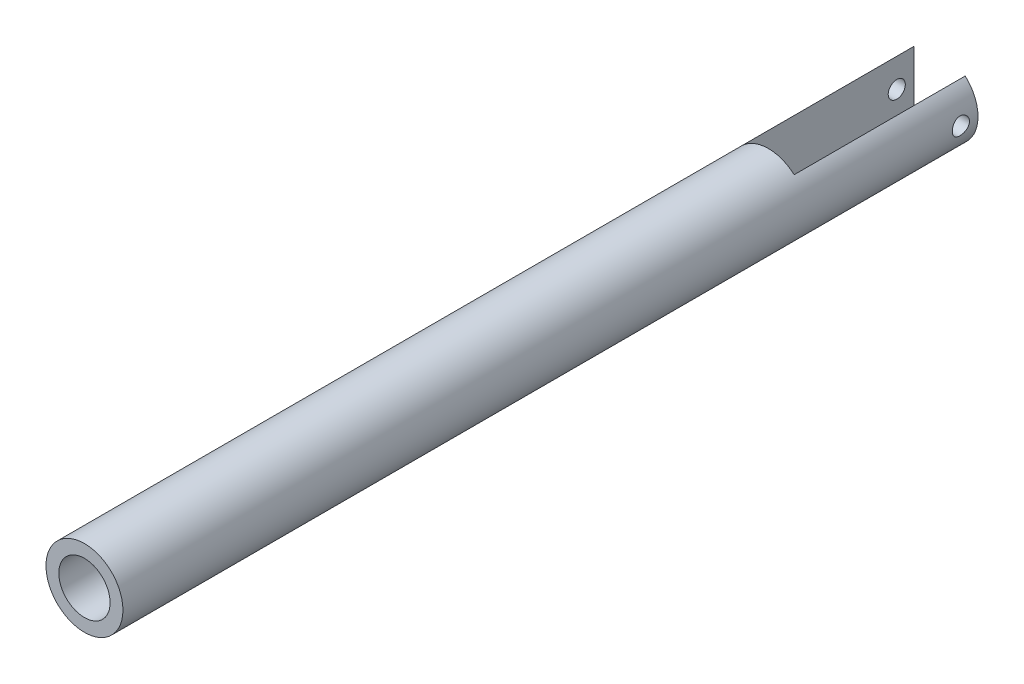
ISO-10303-21;
HEADER;
FILE_DESCRIPTION(('STEP AP214'),'2;1');
FILE_NAME('part.step','',(''),(''),'','','');
FILE_SCHEMA(('AUTOMOTIVE_DESIGN { 1 0 10303 214 1 1 1 1 }'));
ENDSEC;
DATA;
#1=APPLICATION_CONTEXT('core data for automotive mechanical design processes');
#2=APPLICATION_PROTOCOL_DEFINITION('international standard','automotive_design',2000,#1);
#3=PRODUCT_CONTEXT('',#1,'mechanical');
#4=PRODUCT('Part','Part','',(#3));
#5=PRODUCT_RELATED_PRODUCT_CATEGORY('part','',(#4));
#6=PRODUCT_DEFINITION_FORMATION('','',#4);
#7=PRODUCT_DEFINITION_CONTEXT('part definition',#1,'design');
#8=PRODUCT_DEFINITION('design','',#6,#7);
#9=PRODUCT_DEFINITION_SHAPE('','',#8);
#10=(LENGTH_UNIT() NAMED_UNIT(*) SI_UNIT(.MILLI.,.METRE.));
#11=(NAMED_UNIT(*) PLANE_ANGLE_UNIT() SI_UNIT($,.RADIAN.));
#12=(NAMED_UNIT(*) SI_UNIT($,.STERADIAN.) SOLID_ANGLE_UNIT());
#13=UNCERTAINTY_MEASURE_WITH_UNIT(LENGTH_MEASURE(1.E-05),#10,'distance_accuracy_value','');
#14=(GEOMETRIC_REPRESENTATION_CONTEXT(3) GLOBAL_UNCERTAINTY_ASSIGNED_CONTEXT((#13)) GLOBAL_UNIT_ASSIGNED_CONTEXT((#10,
#11,#12)) REPRESENTATION_CONTEXT('',''));
#15=CARTESIAN_POINT('',(0.,0.,0.));
#16=DIRECTION('',(0.,0.,1.));
#17=DIRECTION('',(1.,0.,0.));
#18=AXIS2_PLACEMENT_3D('',#15,#16,#17);
#19=CARTESIAN_POINT('',(0.,0.,80.));
#20=DIRECTION('',(0.,0.,-1.));
#21=DIRECTION('',(-1.,0.,0.));
#22=AXIS2_PLACEMENT_3D('',#19,#20,#21);
#23=CYLINDRICAL_SURFACE('',#22,3.);
#24=CARTESIAN_POINT('',(0.,0.,80.));
#25=DIRECTION('',(0.,0.,1.));
#26=DIRECTION('',(1.,0.,0.));
#27=AXIS2_PLACEMENT_3D('',#24,#25,#26);
#28=CIRCLE('',#27,3.);
#29=CARTESIAN_POINT('',(3.,0.,80.));
#30=VERTEX_POINT('',#29);
#31=EDGE_CURVE('E113',#30,#30,#28,.T.);
#32=ORIENTED_EDGE('',*,*,#31,.T.);
#33=EDGE_LOOP('',(#32));
#34=FACE_BOUND('',#33,.T.);
#35=CARTESIAN_POINT('',(0.,0.,62.));
#36=DIRECTION('',(0.,0.,-1.));
#37=DIRECTION('',(-1.,0.,0.));
#38=AXIS2_PLACEMENT_3D('',#35,#36,#37);
#39=CIRCLE('',#38,3.);
#40=CARTESIAN_POINT('',(-3.,0.,62.));
#41=VERTEX_POINT('',#40);
#42=EDGE_CURVE('E369',#41,#41,#39,.T.);
#43=ORIENTED_EDGE('',*,*,#42,.T.);
#44=EDGE_LOOP('',(#43));
#45=FACE_BOUND('',#44,.T.);
#46=ADVANCED_FACE('F34',(#34,#45),#23,.F.);
#47=CARTESIAN_POINT('',(0.,0.,60.));
#48=DIRECTION('',(0.,0.,-1.));
#49=DIRECTION('',(-1.,0.,0.));
#50=AXIS2_PLACEMENT_3D('',#47,#48,#49);
#51=CIRCLE('',#50,3.);
#52=CARTESIAN_POINT('',(-3.,0.,60.));
#53=VERTEX_POINT('',#52);
#54=EDGE_CURVE('E11',#53,#53,#51,.T.);
#55=ORIENTED_EDGE('',*,*,#54,.F.);
#56=EDGE_LOOP('',(#55));
#57=FACE_BOUND('',#56,.T.);
#58=CARTESIAN_POINT('',(0.,0.,30.));
#59=DIRECTION('',(0.,0.,-1.));
#60=DIRECTION('',(-1.,0.,0.));
#61=AXIS2_PLACEMENT_3D('',#58,#59,#60);
#62=CIRCLE('',#61,3.);
#63=CARTESIAN_POINT('',(-3.,0.,30.));
#64=VERTEX_POINT('',#63);
#65=EDGE_CURVE('E361',#64,#64,#62,.T.);
#66=ORIENTED_EDGE('',*,*,#65,.T.);
#67=EDGE_LOOP('',(#66));
#68=FACE_BOUND('',#67,.T.);
#69=ADVANCED_FACE('F153',(#57,#68),#23,.F.);
#70=CARTESIAN_POINT('',(0.,0.,0.));
#71=DIRECTION('',(0.,0.,1.));
#72=DIRECTION('',(1.,0.,0.));
#73=AXIS2_PLACEMENT_3D('',#70,#71,#72);
#74=PLANE('',#73);
#75=DIRECTION('',(0.,1.,0.));
#76=VECTOR('',#75,1.);
#77=CARTESIAN_POINT('',(3.,3.35410196624968,0.));
#78=LINE('',#77,#76);
#79=CARTESIAN_POINT('',(3.,-3.35410196624969,0.));
#80=VERTEX_POINT('',#79);
#81=CARTESIAN_POINT('',(3.,0.,0.));
#82=VERTEX_POINT('',#81);
#83=EDGE_CURVE('E93',#80,#82,#78,.T.);
#84=ORIENTED_EDGE('',*,*,#83,.F.);
#85=CARTESIAN_POINT('',(0.,0.,0.));
#86=DIRECTION('',(0.,0.,1.));
#87=DIRECTION('',(1.,0.,0.));
#88=AXIS2_PLACEMENT_3D('',#85,#86,#87);
#89=CIRCLE('',#88,4.5);
#90=CARTESIAN_POINT('',(-3.,-3.35410196624968,0.));
#91=VERTEX_POINT('',#90);
#92=EDGE_CURVE('E97',#91,#80,#89,.T.);
#93=ORIENTED_EDGE('',*,*,#92,.F.);
#94=DIRECTION('',(0.,-1.,0.));
#95=VECTOR('',#94,1.);
#96=CARTESIAN_POINT('',(-3.,3.35410196624968,0.));
#97=LINE('',#96,#95);
#98=CARTESIAN_POINT('',(-3.,0.,0.));
#99=VERTEX_POINT('',#98);
#100=EDGE_CURVE('E117',#99,#91,#97,.T.);
#101=ORIENTED_EDGE('',*,*,#100,.F.);
#102=CARTESIAN_POINT('',(0.,0.,0.));
#103=DIRECTION('',(0.,0.,1.));
#104=DIRECTION('',(1.,0.,0.));
#105=AXIS2_PLACEMENT_3D('',#102,#103,#104);
#106=CIRCLE('',#105,3.);
#107=EDGE_CURVE('E156',#99,#82,#106,.T.);
#108=ORIENTED_EDGE('',*,*,#107,.T.);
#109=EDGE_LOOP('',(#84,#93,#101,#108));
#110=FACE_BOUND('',#109,.T.);
#111=ADVANCED_FACE('F180',(#110),#74,.F.);
#112=CARTESIAN_POINT('',(3.,3.35410196624968,0.));
#113=VERTEX_POINT('',#112);
#114=EDGE_CURVE('E161',#82,#113,#78,.T.);
#115=ORIENTED_EDGE('',*,*,#114,.F.);
#116=EDGE_CURVE('E58',#82,#99,#106,.T.);
#117=ORIENTED_EDGE('',*,*,#116,.T.);
#118=CARTESIAN_POINT('',(-3.,3.35410196624968,0.));
#119=VERTEX_POINT('',#118);
#120=EDGE_CURVE('E98',#119,#99,#97,.T.);
#121=ORIENTED_EDGE('',*,*,#120,.F.);
#122=EDGE_CURVE('E128',#113,#119,#89,.T.);
#123=ORIENTED_EDGE('',*,*,#122,.F.);
#124=EDGE_LOOP('',(#115,#117,#121,#123));
#125=FACE_BOUND('',#124,.T.);
#126=ADVANCED_FACE('F160',(#125),#74,.F.);
#127=CARTESIAN_POINT('',(0.,0.,80.));
#128=DIRECTION('',(0.,0.,1.));
#129=DIRECTION('',(1.,0.,0.));
#130=AXIS2_PLACEMENT_3D('',#127,#128,#129);
#131=PLANE('',#130);
#132=CARTESIAN_POINT('',(0.,0.,80.));
#133=DIRECTION('',(0.,0.,1.));
#134=DIRECTION('',(1.,0.,0.));
#135=AXIS2_PLACEMENT_3D('',#132,#133,#134);
#136=CIRCLE('',#135,4.5);
#137=CARTESIAN_POINT('',(4.5,0.,80.));
#138=VERTEX_POINT('',#137);
#139=EDGE_CURVE('E134',#138,#138,#136,.T.);
#140=ORIENTED_EDGE('',*,*,#139,.T.);
#141=EDGE_LOOP('',(#140));
#142=FACE_BOUND('',#141,.T.);
#143=ORIENTED_EDGE('',*,*,#31,.F.);
#144=EDGE_LOOP('',(#143));
#145=FACE_BOUND('',#144,.T.);
#146=ADVANCED_FACE('F185',(#142,#145),#131,.T.);
#147=CARTESIAN_POINT('',(0.,0.,80.));
#148=DIRECTION('',(0.,0.,-1.));
#149=DIRECTION('',(-1.,0.,0.));
#150=AXIS2_PLACEMENT_3D('',#147,#148,#149);
#151=CYLINDRICAL_SURFACE('',#150,4.5);
#152=CARTESIAN_POINT('',(4.5,0.,-17.));
#153=CARTESIAN_POINT('',(4.49999898109126,0.0554402383878235,-17.0000018618399));
#154=CARTESIAN_POINT('',(4.49896506997846,0.11090278263481,-17.0046259908317));
#155=CARTESIAN_POINT('',(4.49494048878835,0.220250972051567,-17.0229802361753));
#156=CARTESIAN_POINT('',(4.49194845108674,0.274135487569493,-17.0367167170046));
#157=CARTESIAN_POINT('',(4.48434056584504,0.378731638880763,-17.0728429852458));
#158=CARTESIAN_POINT('',(4.47972644219541,0.42944657605014,-17.0952235884989));
#159=CARTESIAN_POINT('',(4.46937167720689,0.526400090156879,-17.1479733062362));
#160=CARTESIAN_POINT('',(4.46363105773679,0.572638753966672,-17.1783422656453));
#161=CARTESIAN_POINT('',(4.45154547087105,0.660093157007017,-17.2467378325533));
#162=CARTESIAN_POINT('',(4.44519280820714,0.701224306021769,-17.2848712510676));
#163=CARTESIAN_POINT('',(4.43265300539893,0.776562455229187,-17.3674840300466));
#164=CARTESIAN_POINT('',(4.42646588044024,0.810768822054278,-17.4119639703552));
#165=CARTESIAN_POINT('',(4.41488164130856,0.871662217051753,-17.5066359220292));
#166=CARTESIAN_POINT('',(4.40949437871491,0.898258710522018,-17.5568874790208));
#167=CARTESIAN_POINT('',(4.40023048176197,0.942596494772541,-17.6612863808462));
#168=CARTESIAN_POINT('',(4.39635366052386,0.96033888110048,-17.7154332427521));
#169=CARTESIAN_POINT('',(4.39062804729594,0.986184290032022,-17.8251667386613));
#170=CARTESIAN_POINT('',(4.38874772903891,0.994437335190344,-17.8807163575527));
#171=CARTESIAN_POINT('',(4.38713336865335,1.00153635498837,-17.9924411088931));
#172=CARTESIAN_POINT('',(4.38739905389469,1.00038352455832,-18.0486161609811));
#173=CARTESIAN_POINT('',(4.39001816074073,0.988824137586509,-18.1588783135969));
#174=CARTESIAN_POINT('',(4.3923321569242,0.978592322301085,-18.2129848120697));
#175=CARTESIAN_POINT('',(4.39872477095838,0.94944245340573,-18.3186935716625));
#176=CARTESIAN_POINT('',(4.40280349066588,0.930523898408258,-18.3702956880427));
#177=CARTESIAN_POINT('',(4.41230454985148,0.884378364364374,-18.4700197191909));
#178=CARTESIAN_POINT('',(4.41773762181245,0.857084596896764,-18.518109663668));
#179=CARTESIAN_POINT('',(4.42932868955372,0.795010340699248,-18.6090914352579));
#180=CARTESIAN_POINT('',(4.43548678710298,0.760228800371372,-18.6519825309101));
#181=CARTESIAN_POINT('',(4.44800287306333,0.683243418514915,-18.7323546546742));
#182=CARTESIAN_POINT('',(4.45436225343936,0.640891102633117,-18.7696933925525));
#183=CARTESIAN_POINT('',(4.46643919561158,0.550453309045809,-18.8367618644536));
#184=CARTESIAN_POINT('',(4.47215674504213,0.502367720918684,-18.866491451891));
#185=CARTESIAN_POINT('',(4.48232532116804,0.401651595367365,-18.9175346378884));
#186=CARTESIAN_POINT('',(4.4867734650383,0.349011061159925,-18.9388291221541));
#187=CARTESIAN_POINT('',(4.49388068183127,0.240777965490727,-18.9722305065289));
#188=CARTESIAN_POINT('',(4.49654002348392,0.185185848796682,-18.9843387867071));
#189=CARTESIAN_POINT('',(4.49973158880836,0.0738477416404226,-18.9988160066276));
#190=CARTESIAN_POINT('',(4.50030624311145,0.0181281986594525,-19.0013792500808));
#191=CARTESIAN_POINT('',(4.49938279325299,-0.0929429619640404,-18.9972209478698));
#192=CARTESIAN_POINT('',(4.4978848344523,-0.148294605135324,-18.9905000533403));
#193=CARTESIAN_POINT('',(4.49301129379307,-0.256411628664712,-18.968125292416));
#194=CARTESIAN_POINT('',(4.4896572350388,-0.309199245857743,-18.9525737718883));
#195=CARTESIAN_POINT('',(4.48144710543397,-0.411416402927917,-18.9130931562775));
#196=CARTESIAN_POINT('',(4.4765909038233,-0.46084565000509,-18.889163331847));
#197=CARTESIAN_POINT('',(4.4658107661382,-0.55574321994719,-18.8332035616005));
#198=CARTESIAN_POINT('',(4.45987222295124,-0.601142865416124,-18.8010600284969));
#199=CARTESIAN_POINT('',(4.4476151617454,-0.685973482494061,-18.7297343754493));
#200=CARTESIAN_POINT('',(4.44129659275087,-0.725403650867065,-18.690551309834));
#201=CARTESIAN_POINT('',(4.42884439472905,-0.797947740954929,-18.6053659832097));
#202=CARTESIAN_POINT('',(4.42271658832142,-0.830926909700369,-18.5592479549967));
#203=CARTESIAN_POINT('',(4.41147697689154,-0.888673059613762,-18.4620139827946));
#204=CARTESIAN_POINT('',(4.40636512747635,-0.91344039963487,-18.410898257329));
#205=CARTESIAN_POINT('',(4.39778600274463,-0.953890009481297,-18.3053958554474));
#206=CARTESIAN_POINT('',(4.39430939829893,-0.969623931773797,-18.2510297788656));
#207=CARTESIAN_POINT('',(4.38937824848696,-0.991710138292031,-18.1403379075688));
#208=CARTESIAN_POINT('',(4.38792336773666,-0.998063978591784,-18.084012439487));
#209=CARTESIAN_POINT('',(4.38722200724489,-1.00114178320522,-17.9723605608608));
#210=CARTESIAN_POINT('',(4.38792649185062,-0.998079565719669,-17.91704024597));
#211=CARTESIAN_POINT('',(4.39135332478774,-0.982891385608441,-17.8077251450166));
#212=CARTESIAN_POINT('',(4.39407564773517,-0.9707655370012,-17.7537303422883));
#213=CARTESIAN_POINT('',(4.40120714065762,-0.937899099903725,-17.6487754398863));
#214=CARTESIAN_POINT('',(4.40561002591385,-0.91719058314227,-17.5978048415592));
#215=CARTESIAN_POINT('',(4.41560882234529,-0.867773851741713,-17.5000300037266));
#216=CARTESIAN_POINT('',(4.42120486238316,-0.83906477292597,-17.453226215018));
#217=CARTESIAN_POINT('',(4.43310521417665,-0.773756794952791,-17.364061695526));
#218=CARTESIAN_POINT('',(4.4394218568387,-0.737005927555193,-17.3218138975387));
#219=CARTESIAN_POINT('',(4.45196987086694,-0.656964352972521,-17.2440149630343));
#220=CARTESIAN_POINT('',(4.45820122214526,-0.613672133116719,-17.2084653797458));
#221=CARTESIAN_POINT('',(4.46997629863291,-0.521072985322785,-17.14461200854));
#222=CARTESIAN_POINT('',(4.47550961749614,-0.471692818317476,-17.1164124001325));
#223=CARTESIAN_POINT('',(4.48516029184624,-0.36878013988941,-17.0687583479094));
#224=CARTESIAN_POINT('',(4.48927881635408,-0.315251101656498,-17.0492966799769));
#225=CARTESIAN_POINT('',(4.49491406454777,-0.218069123864705,-17.0230793248616));
#226=CARTESIAN_POINT('',(4.49680934511605,-0.174935995950841,-17.0144413131669));
#227=CARTESIAN_POINT('',(4.49935268729894,-0.0878732249472642,-17.0029010478469));
#228=CARTESIAN_POINT('',(4.50000080761806,-0.0439436194464396,-16.9999985242491));
#229=CARTESIAN_POINT('',(4.5,0.,-17.));
#230=B_SPLINE_CURVE_WITH_KNOTS('',3,(#152,#153,#154,#155,#156,#157,#158,#159,#160,#161,#162,
#163,#164,#165,#166,#167,#168,#169,#170,#171,#172,#173,#174,#175,#176,#177,#178,#179,#180,#181,
#182,#183,#184,#185,#186,#187,#188,#189,#190,#191,#192,#193,#194,#195,#196,#197,#198,#199,#200,
#201,#202,#203,#204,#205,#206,#207,#208,#209,#210,#211,#212,#213,#214,#215,#216,#217,#218,#219,
#220,#221,#222,#223,#224,#225,#226,#227,#228,#229),.UNSPECIFIED.,.T.,.F.,(4,2,2,2,2,2,2,2,2,2,2,
2,2,2,2,2,2,2,2,2,2,2,2,2,2,2,2,2,2,2,2,2,2,2,2,2,2,2,4),(0.,0.166159844864899,
0.332435865624642,0.498535706203726,0.664632322584945,0.833190360010397,1.00176380745257,
1.17226648148988,1.3427480534387,1.51049562819054,1.67822189248296,1.84278834072892,
2.0073642887347,2.17328834854791,2.3392357262915,2.50889089904489,2.67854933984914,
2.84859006405619,3.01860523750994,3.18513996062135,3.35166300456134,3.51629434712584,
3.6809400247273,3.84799901631021,4.01508046693879,4.18534736552865,4.35560682255206,
4.52488279527622,4.69413068343206,4.85956392571209,5.0249950869143,5.1898135600789,
5.35464984293194,5.52292163156413,5.69123239233206,5.86181293524785,6.03225218935469,
6.16396173679279,6.29566508443976),.UNSPECIFIED.);
#231=CARTESIAN_POINT('',(4.5,0.,-17.));
#232=VERTEX_POINT('',#231);
#233=EDGE_CURVE('E191',#232,#232,#230,.T.);
#234=ORIENTED_EDGE('',*,*,#233,.T.);
#235=EDGE_LOOP('',(#234));
#236=FACE_BOUND('',#235,.T.);
#237=CARTESIAN_POINT('',(-4.5,0.,-17.));
#238=CARTESIAN_POINT('',(-4.49999898109126,-0.0554402383878243,-17.0000018618399));
#239=CARTESIAN_POINT('',(-4.49896506997846,-0.110902782634811,-17.0046259908317));
#240=CARTESIAN_POINT('',(-4.49494048878835,-0.220250972051567,-17.0229802361753));
#241=CARTESIAN_POINT('',(-4.49194845108674,-0.274135487569494,-17.0367167170046));
#242=CARTESIAN_POINT('',(-4.48434056584504,-0.378731638880765,-17.0728429852458));
#243=CARTESIAN_POINT('',(-4.47972644219541,-0.429446576050143,-17.0952235884989));
#244=CARTESIAN_POINT('',(-4.46937167720689,-0.526400090156882,-17.1479733062362));
#245=CARTESIAN_POINT('',(-4.46363105773679,-0.572638753966674,-17.1783422656453));
#246=CARTESIAN_POINT('',(-4.45154547087105,-0.660093157007018,-17.2467378325533));
#247=CARTESIAN_POINT('',(-4.44519280820714,-0.701224306021768,-17.2848712510676));
#248=CARTESIAN_POINT('',(-4.43265300539893,-0.776562455229186,-17.3674840300466));
#249=CARTESIAN_POINT('',(-4.42646588044024,-0.810768822054277,-17.4119639703552));
#250=CARTESIAN_POINT('',(-4.41488164130856,-0.871662217051753,-17.5066359220292));
#251=CARTESIAN_POINT('',(-4.40949437871491,-0.898258710522019,-17.5568874790208));
#252=CARTESIAN_POINT('',(-4.40023048176197,-0.942596494772542,-17.6612863808462));
#253=CARTESIAN_POINT('',(-4.39635366052386,-0.960338881100481,-17.7154332427521));
#254=CARTESIAN_POINT('',(-4.39062804729594,-0.986184290032023,-17.8251667386613));
#255=CARTESIAN_POINT('',(-4.38874772903891,-0.994437335190346,-17.8807163575527));
#256=CARTESIAN_POINT('',(-4.38713336865335,-1.00153635498837,-17.9924411088931));
#257=CARTESIAN_POINT('',(-4.38739905389469,-1.00038352455832,-18.0486161609811));
#258=CARTESIAN_POINT('',(-4.39001816074073,-0.988824137586511,-18.1588783135969));
#259=CARTESIAN_POINT('',(-4.3923321569242,-0.978592322301087,-18.2129848120697));
#260=CARTESIAN_POINT('',(-4.39872477095838,-0.949442453405732,-18.3186935716625));
#261=CARTESIAN_POINT('',(-4.40280349066588,-0.93052389840826,-18.3702956880427));
#262=CARTESIAN_POINT('',(-4.41230454985148,-0.884378364364377,-18.4700197191909));
#263=CARTESIAN_POINT('',(-4.41773762181245,-0.857084596896767,-18.518109663668));
#264=CARTESIAN_POINT('',(-4.42932868955372,-0.795010340699251,-18.6090914352579));
#265=CARTESIAN_POINT('',(-4.43548678710298,-0.760228800371374,-18.6519825309101));
#266=CARTESIAN_POINT('',(-4.44800287306333,-0.683243418514916,-18.7323546546742));
#267=CARTESIAN_POINT('',(-4.45436225343936,-0.640891102633118,-18.7696933925525));
#268=CARTESIAN_POINT('',(-4.46643919561159,-0.550453309045811,-18.8367618644536));
#269=CARTESIAN_POINT('',(-4.47215674504213,-0.502367720918685,-18.866491451891));
#270=CARTESIAN_POINT('',(-4.48232532116804,-0.401651595367367,-18.9175346378884));
#271=CARTESIAN_POINT('',(-4.4867734650383,-0.349011061159927,-18.9388291221541));
#272=CARTESIAN_POINT('',(-4.49388068183127,-0.240777965490729,-18.9722305065289));
#273=CARTESIAN_POINT('',(-4.49654002348392,-0.185185848796684,-18.9843387867071));
#274=CARTESIAN_POINT('',(-4.49973158880836,-0.0738477416404245,-18.9988160066276));
#275=CARTESIAN_POINT('',(-4.50030624311145,-0.0181281986594545,-19.0013792500808));
#276=CARTESIAN_POINT('',(-4.49938279325299,0.0929429619640383,-18.9972209478698));
#277=CARTESIAN_POINT('',(-4.4978848344523,0.148294605135322,-18.9905000533403));
#278=CARTESIAN_POINT('',(-4.49301129379307,0.25641162866471,-18.968125292416));
#279=CARTESIAN_POINT('',(-4.4896572350388,0.309199245857741,-18.9525737718883));
#280=CARTESIAN_POINT('',(-4.48144710543397,0.411416402927915,-18.9130931562775));
#281=CARTESIAN_POINT('',(-4.4765909038233,0.460845650005088,-18.889163331847));
#282=CARTESIAN_POINT('',(-4.4658107661382,0.555743219947189,-18.8332035616005));
#283=CARTESIAN_POINT('',(-4.45987222295124,0.601142865416122,-18.8010600284969));
#284=CARTESIAN_POINT('',(-4.4476151617454,0.685973482494059,-18.7297343754493));
#285=CARTESIAN_POINT('',(-4.44129659275087,0.725403650867063,-18.690551309834));
#286=CARTESIAN_POINT('',(-4.42884439472905,0.797947740954928,-18.6053659832097));
#287=CARTESIAN_POINT('',(-4.42271658832142,0.830926909700367,-18.5592479549967));
#288=CARTESIAN_POINT('',(-4.41147697689154,0.888673059613761,-18.4620139827946));
#289=CARTESIAN_POINT('',(-4.40636512747635,0.913440399634868,-18.410898257329));
#290=CARTESIAN_POINT('',(-4.39778600274463,0.953890009481296,-18.3053958554474));
#291=CARTESIAN_POINT('',(-4.39430939829893,0.969623931773795,-18.2510297788656));
#292=CARTESIAN_POINT('',(-4.38937824848696,0.99171013829203,-18.1403379075688));
#293=CARTESIAN_POINT('',(-4.38792336773666,0.998063978591782,-18.084012439487));
#294=CARTESIAN_POINT('',(-4.38722200724489,1.00114178320522,-17.9723605608608));
#295=CARTESIAN_POINT('',(-4.38792649185062,0.998079565719668,-17.91704024597));
#296=CARTESIAN_POINT('',(-4.39135332478774,0.98289138560844,-17.8077251450166));
#297=CARTESIAN_POINT('',(-4.39407564773517,0.970765537001198,-17.7537303422883));
#298=CARTESIAN_POINT('',(-4.40120714065762,0.937899099903723,-17.6487754398863));
#299=CARTESIAN_POINT('',(-4.40561002591385,0.917190583142269,-17.5978048415592));
#300=CARTESIAN_POINT('',(-4.41560882234529,0.867773851741711,-17.5000300037266));
#301=CARTESIAN_POINT('',(-4.42120486238316,0.839064772925968,-17.453226215018));
#302=CARTESIAN_POINT('',(-4.43310521417665,0.77375679495279,-17.364061695526));
#303=CARTESIAN_POINT('',(-4.4394218568387,0.737005927555191,-17.3218138975387));
#304=CARTESIAN_POINT('',(-4.45196987086694,0.65696435297252,-17.2440149630343));
#305=CARTESIAN_POINT('',(-4.45820122214526,0.613672133116718,-17.2084653797458));
#306=CARTESIAN_POINT('',(-4.46997629863291,0.521072985322784,-17.14461200854));
#307=CARTESIAN_POINT('',(-4.47550961749614,0.471692818317475,-17.1164124001325));
#308=CARTESIAN_POINT('',(-4.48516029184624,0.368780139889408,-17.0687583479094));
#309=CARTESIAN_POINT('',(-4.48927881635408,0.315251101656496,-17.0492966799769));
#310=CARTESIAN_POINT('',(-4.49491406454777,0.218069123864703,-17.0230793248616));
#311=CARTESIAN_POINT('',(-4.49680934511605,0.17493599595084,-17.0144413131669));
#312=CARTESIAN_POINT('',(-4.49935268729894,0.0878732249472635,-17.0029010478469));
#313=CARTESIAN_POINT('',(-4.50000080761806,0.0439436194464389,-16.9999985242491));
#314=CARTESIAN_POINT('',(-4.5,0.,-17.));
#315=B_SPLINE_CURVE_WITH_KNOTS('',3,(#237,#238,#239,#240,#241,#242,#243,#244,#245,#246,#247,
#248,#249,#250,#251,#252,#253,#254,#255,#256,#257,#258,#259,#260,#261,#262,#263,#264,#265,#266,
#267,#268,#269,#270,#271,#272,#273,#274,#275,#276,#277,#278,#279,#280,#281,#282,#283,#284,#285,
#286,#287,#288,#289,#290,#291,#292,#293,#294,#295,#296,#297,#298,#299,#300,#301,#302,#303,#304,
#305,#306,#307,#308,#309,#310,#311,#312,#313,#314),.UNSPECIFIED.,.T.,.F.,(4,2,2,2,2,2,2,2,2,2,2,
2,2,2,2,2,2,2,2,2,2,2,2,2,2,2,2,2,2,2,2,2,2,2,2,2,2,2,4),(0.,0.166159844864899,
0.332435865624642,0.49853570620373,0.664632322584946,0.833190360010396,1.00176380745257,
1.17226648148988,1.3427480534387,1.51049562819054,1.67822189248296,1.84278834072892,
2.0073642887347,2.17328834854791,2.3392357262915,2.50889089904489,2.67854933984914,
2.84859006405619,3.01860523750994,3.18513996062135,3.35166300456134,3.51629434712584,
3.6809400247273,3.84799901631021,4.01508046693879,4.18534736552865,4.35560682255206,
4.52488279527622,4.69413068343206,4.85956392571209,5.0249950869143,5.1898135600789,
5.35464984293194,5.52292163156413,5.69123239233206,5.86181293524785,6.03225218935468,
6.16396173679279,6.29566508443976),.UNSPECIFIED.);
#316=CARTESIAN_POINT('',(-4.5,0.,-17.));
#317=VERTEX_POINT('',#316);
#318=EDGE_CURVE('E199',#317,#317,#315,.T.);
#319=ORIENTED_EDGE('',*,*,#318,.T.);
#320=EDGE_LOOP('',(#319));
#321=FACE_BOUND('',#320,.T.);
#322=ORIENTED_EDGE('',*,*,#139,.F.);
#323=EDGE_LOOP('',(#322));
#324=FACE_BOUND('',#323,.T.);
#325=ORIENTED_EDGE('',*,*,#92,.T.);
#326=DIRECTION('',(0.,0.,1.));
#327=VECTOR('',#326,1.);
#328=CARTESIAN_POINT('',(3.,-3.35410196624969,-20.));
#329=LINE('',#328,#327);
#330=CARTESIAN_POINT('',(3.,-3.35410196624969,-20.));
#331=VERTEX_POINT('',#330);
#332=EDGE_CURVE('E87',#331,#80,#329,.T.);
#333=ORIENTED_EDGE('',*,*,#332,.F.);
#334=CARTESIAN_POINT('',(0.,0.,-20.));
#335=DIRECTION('',(0.,0.,-1.));
#336=DIRECTION('',(-1.,0.,0.));
#337=AXIS2_PLACEMENT_3D('',#334,#335,#336);
#338=CIRCLE('',#337,4.5);
#339=CARTESIAN_POINT('',(3.,3.35410196624968,-20.));
#340=VERTEX_POINT('',#339);
#341=EDGE_CURVE('E90',#340,#331,#338,.T.);
#342=ORIENTED_EDGE('',*,*,#341,.F.);
#343=DIRECTION('',(0.,0.,1.));
#344=VECTOR('',#343,1.);
#345=CARTESIAN_POINT('',(3.,3.35410196624968,-20.));
#346=LINE('',#345,#344);
#347=EDGE_CURVE('E50',#340,#113,#346,.T.);
#348=ORIENTED_EDGE('',*,*,#347,.T.);
#349=ORIENTED_EDGE('',*,*,#122,.T.);
#350=DIRECTION('',(0.,0.,1.));
#351=VECTOR('',#350,1.);
#352=CARTESIAN_POINT('',(-3.,3.35410196624968,-20.));
#353=LINE('',#352,#351);
#354=CARTESIAN_POINT('',(-3.,3.35410196624968,-20.));
#355=VERTEX_POINT('',#354);
#356=EDGE_CURVE('E123',#355,#119,#353,.T.);
#357=ORIENTED_EDGE('',*,*,#356,.F.);
#358=CARTESIAN_POINT('',(0.,0.,-20.));
#359=DIRECTION('',(0.,0.,-1.));
#360=DIRECTION('',(-1.,0.,0.));
#361=AXIS2_PLACEMENT_3D('',#358,#359,#360);
#362=CIRCLE('',#361,4.5);
#363=CARTESIAN_POINT('',(-3.,-3.35410196624968,-20.));
#364=VERTEX_POINT('',#363);
#365=EDGE_CURVE('E101',#364,#355,#362,.T.);
#366=ORIENTED_EDGE('',*,*,#365,.F.);
#367=DIRECTION('',(0.,0.,1.));
#368=VECTOR('',#367,1.);
#369=CARTESIAN_POINT('',(-3.,-3.35410196624968,-20.));
#370=LINE('',#369,#368);
#371=EDGE_CURVE('E110',#364,#91,#370,.T.);
#372=ORIENTED_EDGE('',*,*,#371,.T.);
#373=EDGE_LOOP('',(#325,#333,#342,#348,#349,#357,#366,#372));
#374=FACE_BOUND('',#373,.T.);
#375=ADVANCED_FACE('F36',(#236,#321,#324,#374),#151,.T.);
#376=CARTESIAN_POINT('',(0.,0.,28.));
#377=DIRECTION('',(0.,0.,-1.));
#378=DIRECTION('',(-1.,0.,0.));
#379=AXIS2_PLACEMENT_3D('',#376,#377,#378);
#380=CIRCLE('',#379,3.);
#381=CARTESIAN_POINT('',(-3.,0.,28.));
#382=VERTEX_POINT('',#381);
#383=EDGE_CURVE('E43',#382,#382,#380,.T.);
#384=ORIENTED_EDGE('',*,*,#383,.F.);
#385=EDGE_LOOP('',(#384));
#386=FACE_BOUND('',#385,.T.);
#387=ORIENTED_EDGE('',*,*,#107,.F.);
#388=ORIENTED_EDGE('',*,*,#116,.F.);
#389=EDGE_LOOP('',(#387,#388));
#390=FACE_BOUND('',#389,.T.);
#391=ADVANCED_FACE('F148',(#386,#390),#23,.F.);
#392=CARTESIAN_POINT('',(-3.,3.35410196624968,-20.));
#393=DIRECTION('',(-1.,0.,0.));
#394=DIRECTION('',(0.,0.,1.));
#395=AXIS2_PLACEMENT_3D('',#392,#393,#394);
#396=PLANE('',#395);
#397=CARTESIAN_POINT('',(-3.,0.,-18.));
#398=DIRECTION('',(-1.,0.,0.));
#399=DIRECTION('',(0.,0.,1.));
#400=AXIS2_PLACEMENT_3D('',#397,#398,#399);
#401=CIRCLE('',#400,1.);
#402=CARTESIAN_POINT('',(-3.,0.,-17.));
#403=VERTEX_POINT('',#402);
#404=EDGE_CURVE('E357',#403,#403,#401,.T.);
#405=ORIENTED_EDGE('',*,*,#404,.T.);
#406=EDGE_LOOP('',(#405));
#407=FACE_BOUND('',#406,.T.);
#408=ORIENTED_EDGE('',*,*,#120,.T.);
#409=ORIENTED_EDGE('',*,*,#100,.T.);
#410=ORIENTED_EDGE('',*,*,#371,.F.);
#411=DIRECTION('',(0.,-1.,0.));
#412=VECTOR('',#411,1.);
#413=CARTESIAN_POINT('',(-3.,3.35410196624968,-20.));
#414=LINE('',#413,#412);
#415=EDGE_CURVE('E108',#355,#364,#414,.T.);
#416=ORIENTED_EDGE('',*,*,#415,.F.);
#417=ORIENTED_EDGE('',*,*,#356,.T.);
#418=EDGE_LOOP('',(#408,#409,#410,#416,#417));
#419=FACE_BOUND('',#418,.T.);
#420=ADVANCED_FACE('F151',(#407,#419),#396,.F.);
#421=CARTESIAN_POINT('',(0.,0.,-20.));
#422=DIRECTION('',(0.,0.,-1.));
#423=DIRECTION('',(-1.,0.,0.));
#424=AXIS2_PLACEMENT_3D('',#421,#422,#423);
#425=PLANE('',#424);
#426=ORIENTED_EDGE('',*,*,#365,.T.);
#427=ORIENTED_EDGE('',*,*,#415,.T.);
#428=EDGE_LOOP('',(#426,#427));
#429=FACE_BOUND('',#428,.T.);
#430=ADVANCED_FACE('F164',(#429),#425,.T.);
#431=CARTESIAN_POINT('',(3.,3.35410196624968,-20.));
#432=DIRECTION('',(1.,0.,0.));
#433=DIRECTION('',(0.,1.,0.));
#434=AXIS2_PLACEMENT_3D('',#431,#432,#433);
#435=PLANE('',#434);
#436=CARTESIAN_POINT('',(3.,0.,-18.));
#437=DIRECTION('',(1.,0.,0.));
#438=DIRECTION('',(0.,1.,0.));
#439=AXIS2_PLACEMENT_3D('',#436,#437,#438);
#440=CIRCLE('',#439,1.);
#441=CARTESIAN_POINT('',(3.,1.,-18.));
#442=VERTEX_POINT('',#441);
#443=EDGE_CURVE('E131',#442,#442,#440,.T.);
#444=ORIENTED_EDGE('',*,*,#443,.T.);
#445=EDGE_LOOP('',(#444));
#446=FACE_BOUND('',#445,.T.);
#447=ORIENTED_EDGE('',*,*,#83,.T.);
#448=ORIENTED_EDGE('',*,*,#114,.T.);
#449=ORIENTED_EDGE('',*,*,#347,.F.);
#450=DIRECTION('',(0.,1.,0.));
#451=VECTOR('',#450,1.);
#452=CARTESIAN_POINT('',(3.,3.35410196624968,-20.));
#453=LINE('',#452,#451);
#454=EDGE_CURVE('E83',#331,#340,#453,.T.);
#455=ORIENTED_EDGE('',*,*,#454,.F.);
#456=ORIENTED_EDGE('',*,*,#332,.T.);
#457=EDGE_LOOP('',(#447,#448,#449,#455,#456));
#458=FACE_BOUND('',#457,.T.);
#459=ADVANCED_FACE('F85',(#446,#458),#435,.F.);
#460=CARTESIAN_POINT('',(0.,0.,-20.));
#461=DIRECTION('',(0.,0.,-1.));
#462=DIRECTION('',(-1.,0.,0.));
#463=AXIS2_PLACEMENT_3D('',#460,#461,#462);
#464=PLANE('',#463);
#465=ORIENTED_EDGE('',*,*,#341,.T.);
#466=ORIENTED_EDGE('',*,*,#454,.T.);
#467=EDGE_LOOP('',(#465,#466));
#468=FACE_BOUND('',#467,.T.);
#469=ADVANCED_FACE('F92',(#468),#464,.T.);
#470=CARTESIAN_POINT('',(4.5,0.,-18.));
#471=DIRECTION('',(-1.,0.,0.));
#472=DIRECTION('',(0.,0.,1.));
#473=AXIS2_PLACEMENT_3D('',#470,#471,#472);
#474=CYLINDRICAL_SURFACE('',#473,1.);
#475=ORIENTED_EDGE('',*,*,#443,.F.);
#476=EDGE_LOOP('',(#475));
#477=FACE_BOUND('',#476,.T.);
#478=ORIENTED_EDGE('',*,*,#233,.F.);
#479=EDGE_LOOP('',(#478));
#480=FACE_BOUND('',#479,.T.);
#481=ADVANCED_FACE('F204',(#477,#480),#474,.F.);
#482=ORIENTED_EDGE('',*,*,#404,.F.);
#483=EDGE_LOOP('',(#482));
#484=FACE_BOUND('',#483,.T.);
#485=ORIENTED_EDGE('',*,*,#318,.F.);
#486=EDGE_LOOP('',(#485));
#487=FACE_BOUND('',#486,.T.);
#488=ADVANCED_FACE('F209',(#484,#487),#474,.F.);
#489=CARTESIAN_POINT('',(0.,0.,28.));
#490=DIRECTION('',(0.,0.,-1.));
#491=DIRECTION('',(-1.,0.,0.));
#492=AXIS2_PLACEMENT_3D('',#489,#490,#491);
#493=PLANE('',#492);
#494=ORIENTED_EDGE('',*,*,#383,.T.);
#495=EDGE_LOOP('',(#494));
#496=FACE_BOUND('',#495,.T.);
#497=CARTESIAN_POINT('',(0.,0.,28.));
#498=DIRECTION('',(0.,0.,-1.));
#499=DIRECTION('',(-1.,0.,0.));
#500=AXIS2_PLACEMENT_3D('',#497,#498,#499);
#501=CIRCLE('',#500,1.);
#502=CARTESIAN_POINT('',(-1.,0.,28.));
#503=VERTEX_POINT('',#502);
#504=EDGE_CURVE('E365',#503,#503,#501,.T.);
#505=ORIENTED_EDGE('',*,*,#504,.F.);
#506=EDGE_LOOP('',(#505));
#507=FACE_BOUND('',#506,.T.);
#508=ADVANCED_FACE('F145',(#496,#507),#493,.T.);
#509=CARTESIAN_POINT('',(0.,0.,30.));
#510=DIRECTION('',(0.,0.,-1.));
#511=DIRECTION('',(-1.,0.,0.));
#512=AXIS2_PLACEMENT_3D('',#509,#510,#511);
#513=PLANE('',#512);
#514=ORIENTED_EDGE('',*,*,#65,.F.);
#515=EDGE_LOOP('',(#514));
#516=FACE_BOUND('',#515,.T.);
#517=CARTESIAN_POINT('',(0.,0.,30.));
#518=DIRECTION('',(0.,0.,-1.));
#519=DIRECTION('',(-1.,0.,0.));
#520=AXIS2_PLACEMENT_3D('',#517,#518,#519);
#521=CIRCLE('',#520,1.);
#522=CARTESIAN_POINT('',(-1.,0.,30.));
#523=VERTEX_POINT('',#522);
#524=EDGE_CURVE('E366',#523,#523,#521,.T.);
#525=ORIENTED_EDGE('',*,*,#524,.T.);
#526=EDGE_LOOP('',(#525));
#527=FACE_BOUND('',#526,.T.);
#528=ADVANCED_FACE('F211',(#516,#527),#513,.F.);
#529=CARTESIAN_POINT('',(0.,0.,28.));
#530=DIRECTION('',(0.,0.,1.));
#531=DIRECTION('',(1.,0.,0.));
#532=AXIS2_PLACEMENT_3D('',#529,#530,#531);
#533=CYLINDRICAL_SURFACE('',#532,1.);
#534=ORIENTED_EDGE('',*,*,#504,.T.);
#535=EDGE_LOOP('',(#534));
#536=FACE_BOUND('',#535,.T.);
#537=ORIENTED_EDGE('',*,*,#524,.F.);
#538=EDGE_LOOP('',(#537));
#539=FACE_BOUND('',#538,.T.);
#540=ADVANCED_FACE('F242',(#536,#539),#533,.F.);
#541=CARTESIAN_POINT('',(0.,0.,62.));
#542=DIRECTION('',(0.,0.,-1.));
#543=DIRECTION('',(-1.,0.,0.));
#544=AXIS2_PLACEMENT_3D('',#541,#542,#543);
#545=PLANE('',#544);
#546=CARTESIAN_POINT('',(0.,0.,62.));
#547=DIRECTION('',(0.,0.,-1.));
#548=DIRECTION('',(-1.,0.,0.));
#549=AXIS2_PLACEMENT_3D('',#546,#547,#548);
#550=CIRCLE('',#549,1.);
#551=CARTESIAN_POINT('',(-1.,0.,62.));
#552=VERTEX_POINT('',#551);
#553=EDGE_CURVE('E374',#552,#552,#550,.T.);
#554=ORIENTED_EDGE('',*,*,#553,.T.);
#555=EDGE_LOOP('',(#554));
#556=FACE_BOUND('',#555,.T.);
#557=ORIENTED_EDGE('',*,*,#42,.F.);
#558=EDGE_LOOP('',(#557));
#559=FACE_BOUND('',#558,.T.);
#560=ADVANCED_FACE('F249',(#556,#559),#545,.F.);
#561=CARTESIAN_POINT('',(0.,0.,60.));
#562=DIRECTION('',(0.,0.,-1.));
#563=DIRECTION('',(-1.,0.,0.));
#564=AXIS2_PLACEMENT_3D('',#561,#562,#563);
#565=PLANE('',#564);
#566=CARTESIAN_POINT('',(0.,0.,60.));
#567=DIRECTION('',(0.,0.,-1.));
#568=DIRECTION('',(-1.,0.,0.));
#569=AXIS2_PLACEMENT_3D('',#566,#567,#568);
#570=CIRCLE('',#569,1.);
#571=CARTESIAN_POINT('',(-1.,0.,60.));
#572=VERTEX_POINT('',#571);
#573=EDGE_CURVE('E375',#572,#572,#570,.T.);
#574=ORIENTED_EDGE('',*,*,#573,.F.);
#575=EDGE_LOOP('',(#574));
#576=FACE_BOUND('',#575,.T.);
#577=ORIENTED_EDGE('',*,*,#54,.T.);
#578=EDGE_LOOP('',(#577));
#579=FACE_BOUND('',#578,.T.);
#580=ADVANCED_FACE('F257',(#576,#579),#565,.T.);
#581=CARTESIAN_POINT('',(0.,0.,62.));
#582=DIRECTION('',(0.,0.,-1.));
#583=DIRECTION('',(-1.,0.,0.));
#584=AXIS2_PLACEMENT_3D('',#581,#582,#583);
#585=CYLINDRICAL_SURFACE('',#584,1.);
#586=ORIENTED_EDGE('',*,*,#553,.F.);
#587=EDGE_LOOP('',(#586));
#588=FACE_BOUND('',#587,.T.);
#589=ORIENTED_EDGE('',*,*,#573,.T.);
#590=EDGE_LOOP('',(#589));
#591=FACE_BOUND('',#590,.T.);
#592=ADVANCED_FACE('F266',(#588,#591),#585,.F.);
#593=CLOSED_SHELL('',(#46,#69,#111,#126,#146,#375,#391,#420,#430,#459,#469,#481,#488,#508,#528,
#540,#560,#580,#592));
#594=MANIFOLD_SOLID_BREP('B2',#593);
#595=ADVANCED_BREP_SHAPE_REPRESENTATION('',(#18,#594),#14);
#596=SHAPE_DEFINITION_REPRESENTATION(#9,#595);
ENDSEC;
END-ISO-10303-21;
